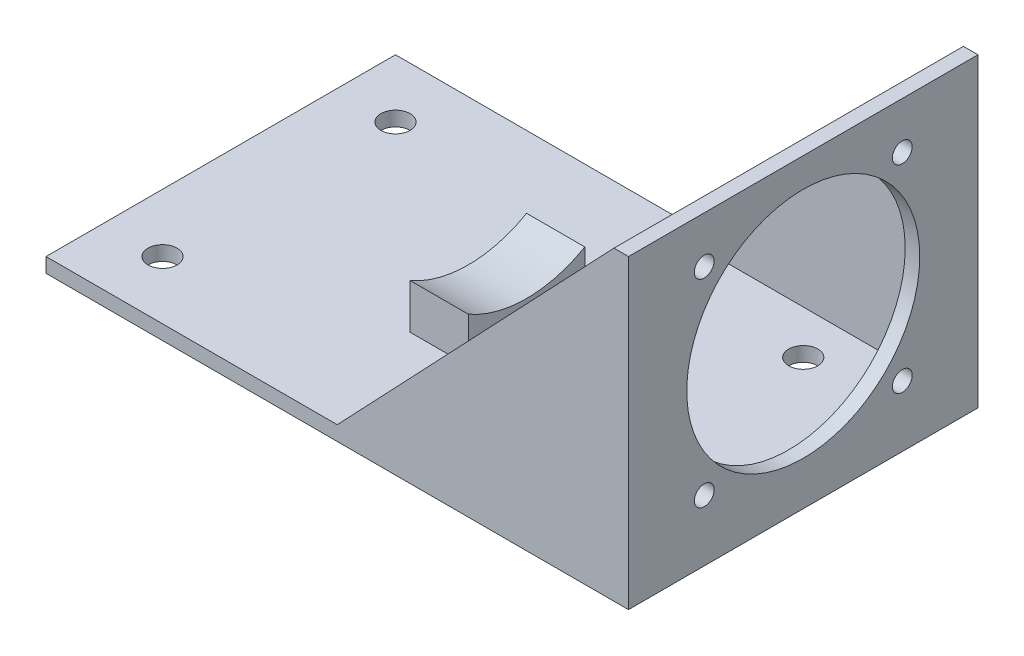
ISO-10303-21;
HEADER;
FILE_DESCRIPTION(('STEP AP214'),'2;1');
FILE_NAME('part.step','',(''),(''),'','','');
FILE_SCHEMA(('AUTOMOTIVE_DESIGN { 1 0 10303 214 1 1 1 1 }'));
ENDSEC;
DATA;
#1=APPLICATION_CONTEXT('core data for automotive mechanical design processes');
#2=APPLICATION_PROTOCOL_DEFINITION('international standard','automotive_design',2000,#1);
#3=PRODUCT_CONTEXT('',#1,'mechanical');
#4=PRODUCT('Part','Part','',(#3));
#5=PRODUCT_RELATED_PRODUCT_CATEGORY('part','',(#4));
#6=PRODUCT_DEFINITION_FORMATION('','',#4);
#7=PRODUCT_DEFINITION_CONTEXT('part definition',#1,'design');
#8=PRODUCT_DEFINITION('design','',#6,#7);
#9=PRODUCT_DEFINITION_SHAPE('','',#8);
#10=(LENGTH_UNIT() NAMED_UNIT(*) SI_UNIT(.MILLI.,.METRE.));
#11=(NAMED_UNIT(*) PLANE_ANGLE_UNIT() SI_UNIT($,.RADIAN.));
#12=(NAMED_UNIT(*) SI_UNIT($,.STERADIAN.) SOLID_ANGLE_UNIT());
#13=UNCERTAINTY_MEASURE_WITH_UNIT(LENGTH_MEASURE(1.E-05),#10,'distance_accuracy_value','');
#14=(GEOMETRIC_REPRESENTATION_CONTEXT(3) GLOBAL_UNCERTAINTY_ASSIGNED_CONTEXT((#13)) GLOBAL_UNIT_ASSIGNED_CONTEXT((#10,
#11,#12)) REPRESENTATION_CONTEXT('',''));
#15=CARTESIAN_POINT('',(0.,0.,0.));
#16=DIRECTION('',(0.,0.,1.));
#17=DIRECTION('',(1.,0.,0.));
#18=AXIS2_PLACEMENT_3D('',#15,#16,#17);
#19=CARTESIAN_POINT('',(0.,6.35,0.));
#20=DIRECTION('',(0.,1.,0.));
#21=DIRECTION('',(0.,0.,1.));
#22=AXIS2_PLACEMENT_3D('',#19,#20,#21);
#23=PLANE('',#22);
#24=CARTESIAN_POINT('',(76.2,6.35,-50.8));
#25=DIRECTION('',(0.,1.,0.));
#26=DIRECTION('',(0.,0.,1.));
#27=AXIS2_PLACEMENT_3D('',#24,#25,#26);
#28=CIRCLE('',#27,6.35);
#29=CARTESIAN_POINT('',(76.2,6.35,-44.45));
#30=VERTEX_POINT('',#29);
#31=EDGE_CURVE('E426',#30,#30,#28,.T.);
#32=ORIENTED_EDGE('',*,*,#31,.F.);
#33=EDGE_LOOP('',(#32));
#34=FACE_BOUND('',#33,.T.);
#35=CARTESIAN_POINT('',(76.2,6.35,50.8));
#36=DIRECTION('',(0.,1.,0.));
#37=DIRECTION('',(0.,0.,1.));
#38=AXIS2_PLACEMENT_3D('',#35,#36,#37);
#39=CIRCLE('',#38,6.35);
#40=CARTESIAN_POINT('',(76.2,6.35,57.15));
#41=VERTEX_POINT('',#40);
#42=EDGE_CURVE('E422',#41,#41,#39,.T.);
#43=ORIENTED_EDGE('',*,*,#42,.F.);
#44=EDGE_LOOP('',(#43));
#45=FACE_BOUND('',#44,.T.);
#46=CARTESIAN_POINT('',(-101.6,6.35,50.8));
#47=DIRECTION('',(0.,1.,0.));
#48=DIRECTION('',(0.,0.,1.));
#49=AXIS2_PLACEMENT_3D('',#46,#47,#48);
#50=CIRCLE('',#49,6.35);
#51=CARTESIAN_POINT('',(-101.6,6.35,57.15));
#52=VERTEX_POINT('',#51);
#53=EDGE_CURVE('E419',#52,#52,#50,.T.);
#54=ORIENTED_EDGE('',*,*,#53,.F.);
#55=EDGE_LOOP('',(#54));
#56=FACE_BOUND('',#55,.T.);
#57=CARTESIAN_POINT('',(-101.6,6.35,-50.8));
#58=DIRECTION('',(0.,1.,0.));
#59=DIRECTION('',(0.,0.,1.));
#60=AXIS2_PLACEMENT_3D('',#57,#58,#59);
#61=CIRCLE('',#60,6.35);
#62=CARTESIAN_POINT('',(-101.6,6.35,-44.45));
#63=VERTEX_POINT('',#62);
#64=EDGE_CURVE('E265',#63,#63,#61,.T.);
#65=ORIENTED_EDGE('',*,*,#64,.F.);
#66=EDGE_LOOP('',(#65));
#67=FACE_BOUND('',#66,.T.);
#68=DIRECTION('',(0.,0.,-1.));
#69=VECTOR('',#68,1.);
#70=CARTESIAN_POINT('',(0.,6.35,-69.85));
#71=LINE('',#70,#69);
#72=CARTESIAN_POINT('',(0.,6.35,-69.85));
#73=VERTEX_POINT('',#72);
#74=CARTESIAN_POINT('',(0.,6.35,-76.2));
#75=VERTEX_POINT('',#74);
#76=EDGE_CURVE('E168',#73,#75,#71,.T.);
#77=ORIENTED_EDGE('',*,*,#76,.T.);
#78=DIRECTION('',(-1.,0.,0.));
#79=VECTOR('',#78,1.);
#80=CARTESIAN_POINT('',(-127.,6.35,-76.2));
#81=LINE('',#80,#79);
#82=CARTESIAN_POINT('',(-127.,6.35,-76.2));
#83=VERTEX_POINT('',#82);
#84=EDGE_CURVE('E235',#75,#83,#81,.T.);
#85=ORIENTED_EDGE('',*,*,#84,.T.);
#86=DIRECTION('',(0.,0.,1.));
#87=VECTOR('',#86,1.);
#88=CARTESIAN_POINT('',(-127.,6.35,-76.2));
#89=LINE('',#88,#87);
#90=CARTESIAN_POINT('',(-127.,6.35,76.2));
#91=VERTEX_POINT('',#90);
#92=EDGE_CURVE('E237',#83,#91,#89,.T.);
#93=ORIENTED_EDGE('',*,*,#92,.T.);
#94=DIRECTION('',(1.,0.,0.));
#95=VECTOR('',#94,1.);
#96=CARTESIAN_POINT('',(-127.,6.35,76.2));
#97=LINE('',#96,#95);
#98=CARTESIAN_POINT('',(0.,6.35,76.2));
#99=VERTEX_POINT('',#98);
#100=EDGE_CURVE('E240',#91,#99,#97,.T.);
#101=ORIENTED_EDGE('',*,*,#100,.T.);
#102=DIRECTION('',(0.,0.,1.));
#103=VECTOR('',#102,1.);
#104=CARTESIAN_POINT('',(0.,6.35,69.85));
#105=LINE('',#104,#103);
#106=CARTESIAN_POINT('',(0.,6.35,69.85));
#107=VERTEX_POINT('',#106);
#108=EDGE_CURVE('E184',#107,#99,#105,.T.);
#109=ORIENTED_EDGE('',*,*,#108,.F.);
#110=DIRECTION('',(1.,0.,0.));
#111=VECTOR('',#110,1.);
#112=CARTESIAN_POINT('',(0.,6.35,69.85));
#113=LINE('',#112,#111);
#114=CARTESIAN_POINT('',(120.65,6.35,69.85));
#115=VERTEX_POINT('',#114);
#116=EDGE_CURVE('E178',#107,#115,#113,.T.);
#117=ORIENTED_EDGE('',*,*,#116,.T.);
#118=DIRECTION('',(0.,0.,-1.));
#119=VECTOR('',#118,1.);
#120=CARTESIAN_POINT('',(120.65,6.35,76.2));
#121=LINE('',#120,#119);
#122=CARTESIAN_POINT('',(120.65,6.35,-69.85));
#123=VERTEX_POINT('',#122);
#124=EDGE_CURVE('E219',#115,#123,#121,.T.);
#125=ORIENTED_EDGE('',*,*,#124,.T.);
#126=DIRECTION('',(-1.,0.,0.));
#127=VECTOR('',#126,1.);
#128=CARTESIAN_POINT('',(0.,6.35,-69.85));
#129=LINE('',#128,#127);
#130=EDGE_CURVE('E162',#123,#73,#129,.T.);
#131=ORIENTED_EDGE('',*,*,#130,.T.);
#132=EDGE_LOOP('',(#77,#85,#93,#101,#109,#117,#125,#131));
#133=FACE_BOUND('',#132,.T.);
#134=DIRECTION('',(-1.,0.,0.));
#135=VECTOR('',#134,1.);
#136=CARTESIAN_POINT('',(-19.05,6.35,-25.4));
#137=LINE('',#136,#135);
#138=CARTESIAN_POINT('',(6.35,6.35,-25.4));
#139=VERTEX_POINT('',#138);
#140=CARTESIAN_POINT('',(-19.05,6.35,-25.4));
#141=VERTEX_POINT('',#140);
#142=EDGE_CURVE('E149',#139,#141,#137,.T.);
#143=ORIENTED_EDGE('',*,*,#142,.F.);
#144=DIRECTION('',(0.,0.,-1.));
#145=VECTOR('',#144,1.);
#146=CARTESIAN_POINT('',(6.35,6.35,-25.4));
#147=LINE('',#146,#145);
#148=CARTESIAN_POINT('',(6.35000000000001,6.35,25.4));
#149=VERTEX_POINT('',#148);
#150=EDGE_CURVE('E140',#149,#139,#147,.T.);
#151=ORIENTED_EDGE('',*,*,#150,.F.);
#152=DIRECTION('',(1.,0.,0.));
#153=VECTOR('',#152,1.);
#154=CARTESIAN_POINT('',(-19.05,6.35,25.4));
#155=LINE('',#154,#153);
#156=CARTESIAN_POINT('',(-19.05,6.35,25.4));
#157=VERTEX_POINT('',#156);
#158=EDGE_CURVE('E434',#157,#149,#155,.T.);
#159=ORIENTED_EDGE('',*,*,#158,.F.);
#160=DIRECTION('',(0.,0.,1.));
#161=VECTOR('',#160,1.);
#162=CARTESIAN_POINT('',(-19.05,6.35,-25.4));
#163=LINE('',#162,#161);
#164=EDGE_CURVE('E432',#141,#157,#163,.T.);
#165=ORIENTED_EDGE('',*,*,#164,.F.);
#166=EDGE_LOOP('',(#143,#151,#159,#165));
#167=FACE_BOUND('',#166,.T.);
#168=ADVANCED_FACE('F38',(#34,#45,#56,#67,#133,#167),#23,.T.);
#169=CARTESIAN_POINT('',(120.65,0.,0.));
#170=DIRECTION('',(-1.,0.,0.));
#171=DIRECTION('',(0.,0.,1.));
#172=AXIS2_PLACEMENT_3D('',#169,#170,#171);
#173=PLANE('',#172);
#174=CARTESIAN_POINT('',(120.65,113.03,43.18));
#175=DIRECTION('',(1.,0.,0.));
#176=DIRECTION('',(0.,0.,-1.));
#177=AXIS2_PLACEMENT_3D('',#174,#175,#176);
#178=CIRCLE('',#177,4.318);
#179=CARTESIAN_POINT('',(120.65,113.03,38.862));
#180=VERTEX_POINT('',#179);
#181=EDGE_CURVE('E189',#180,#180,#178,.T.);
#182=ORIENTED_EDGE('',*,*,#181,.T.);
#183=EDGE_LOOP('',(#182));
#184=FACE_BOUND('',#183,.T.);
#185=CARTESIAN_POINT('',(120.65,113.03,-43.18));
#186=DIRECTION('',(1.,0.,0.));
#187=DIRECTION('',(0.,0.,-1.));
#188=AXIS2_PLACEMENT_3D('',#185,#186,#187);
#189=CIRCLE('',#188,4.318);
#190=CARTESIAN_POINT('',(120.65,113.03,-47.498));
#191=VERTEX_POINT('',#190);
#192=EDGE_CURVE('E195',#191,#191,#189,.T.);
#193=ORIENTED_EDGE('',*,*,#192,.T.);
#194=EDGE_LOOP('',(#193));
#195=FACE_BOUND('',#194,.T.);
#196=CARTESIAN_POINT('',(120.65,26.67,-43.18));
#197=DIRECTION('',(1.,0.,0.));
#198=DIRECTION('',(0.,0.,-1.));
#199=AXIS2_PLACEMENT_3D('',#196,#197,#198);
#200=CIRCLE('',#199,4.318);
#201=CARTESIAN_POINT('',(120.65,26.67,-47.498));
#202=VERTEX_POINT('',#201);
#203=EDGE_CURVE('E201',#202,#202,#200,.T.);
#204=ORIENTED_EDGE('',*,*,#203,.T.);
#205=EDGE_LOOP('',(#204));
#206=FACE_BOUND('',#205,.T.);
#207=CARTESIAN_POINT('',(120.65,26.67,43.18));
#208=DIRECTION('',(1.,0.,0.));
#209=DIRECTION('',(0.,0.,-1.));
#210=AXIS2_PLACEMENT_3D('',#207,#208,#209);
#211=CIRCLE('',#210,4.318);
#212=CARTESIAN_POINT('',(120.65,26.67,38.862));
#213=VERTEX_POINT('',#212);
#214=EDGE_CURVE('E207',#213,#213,#211,.T.);
#215=ORIENTED_EDGE('',*,*,#214,.T.);
#216=EDGE_LOOP('',(#215));
#217=FACE_BOUND('',#216,.T.);
#218=CARTESIAN_POINT('',(120.65,69.85,0.));
#219=DIRECTION('',(1.,0.,0.));
#220=DIRECTION('',(0.,0.,-1.));
#221=AXIS2_PLACEMENT_3D('',#218,#219,#220);
#222=CIRCLE('',#221,50.8);
#223=CARTESIAN_POINT('',(120.65,69.85,-50.8));
#224=VERTEX_POINT('',#223);
#225=EDGE_CURVE('E213',#224,#224,#222,.T.);
#226=ORIENTED_EDGE('',*,*,#225,.T.);
#227=EDGE_LOOP('',(#226));
#228=FACE_BOUND('',#227,.T.);
#229=DIRECTION('',(0.,0.,1.));
#230=VECTOR('',#229,1.);
#231=CARTESIAN_POINT('',(120.65,133.35,76.2));
#232=LINE('',#231,#230);
#233=CARTESIAN_POINT('',(120.65,133.35,-69.85));
#234=VERTEX_POINT('',#233);
#235=CARTESIAN_POINT('',(120.65,133.35,69.85));
#236=VERTEX_POINT('',#235);
#237=EDGE_CURVE('E222',#234,#236,#232,.T.);
#238=ORIENTED_EDGE('',*,*,#237,.F.);
#239=DIRECTION('',(0.,-1.,0.));
#240=VECTOR('',#239,1.);
#241=CARTESIAN_POINT('',(120.65,6.35,-69.85));
#242=LINE('',#241,#240);
#243=EDGE_CURVE('E159',#234,#123,#242,.T.);
#244=ORIENTED_EDGE('',*,*,#243,.T.);
#245=ORIENTED_EDGE('',*,*,#124,.F.);
#246=DIRECTION('',(0.,1.,0.));
#247=VECTOR('',#246,1.);
#248=CARTESIAN_POINT('',(120.65,6.35,69.85));
#249=LINE('',#248,#247);
#250=EDGE_CURVE('E173',#115,#236,#249,.T.);
#251=ORIENTED_EDGE('',*,*,#250,.T.);
#252=EDGE_LOOP('',(#238,#244,#245,#251));
#253=FACE_BOUND('',#252,.T.);
#254=ADVANCED_FACE('F289',(#184,#195,#206,#217,#228,#253),#173,.T.);
#255=CARTESIAN_POINT('',(127.,6.35,-76.2));
#256=DIRECTION('',(-1.,0.,0.));
#257=DIRECTION('',(0.,0.,1.));
#258=AXIS2_PLACEMENT_3D('',#255,#256,#257);
#259=PLANE('',#258);
#260=DIRECTION('',(0.,0.,-1.));
#261=VECTOR('',#260,1.);
#262=CARTESIAN_POINT('',(127.,0.,-76.2));
#263=LINE('',#262,#261);
#264=CARTESIAN_POINT('',(127.,0.,76.2));
#265=VERTEX_POINT('',#264);
#266=CARTESIAN_POINT('',(127.,0.,-76.2));
#267=VERTEX_POINT('',#266);
#268=EDGE_CURVE('E232',#265,#267,#263,.T.);
#269=ORIENTED_EDGE('',*,*,#268,.T.);
#270=DIRECTION('',(0.,-1.,0.));
#271=VECTOR('',#270,1.);
#272=CARTESIAN_POINT('',(127.,6.35,-76.2));
#273=LINE('',#272,#271);
#274=CARTESIAN_POINT('',(127.,133.35,-76.2));
#275=VERTEX_POINT('',#274);
#276=EDGE_CURVE('E47',#275,#267,#273,.T.);
#277=ORIENTED_EDGE('',*,*,#276,.F.);
#278=DIRECTION('',(0.,0.,1.));
#279=VECTOR('',#278,1.);
#280=CARTESIAN_POINT('',(127.,133.35,76.2));
#281=LINE('',#280,#279);
#282=CARTESIAN_POINT('',(127.,133.35,76.2));
#283=VERTEX_POINT('',#282);
#284=EDGE_CURVE('E216',#275,#283,#281,.T.);
#285=ORIENTED_EDGE('',*,*,#284,.T.);
#286=DIRECTION('',(0.,-1.,0.));
#287=VECTOR('',#286,1.);
#288=CARTESIAN_POINT('',(127.,6.35,76.2));
#289=LINE('',#288,#287);
#290=EDGE_CURVE('E243',#283,#265,#289,.T.);
#291=ORIENTED_EDGE('',*,*,#290,.T.);
#292=EDGE_LOOP('',(#269,#277,#285,#291));
#293=FACE_BOUND('',#292,.T.);
#294=CARTESIAN_POINT('',(127.,113.03,43.18));
#295=DIRECTION('',(1.,0.,0.));
#296=DIRECTION('',(0.,0.,-1.));
#297=AXIS2_PLACEMENT_3D('',#294,#295,#296);
#298=CIRCLE('',#297,4.318);
#299=CARTESIAN_POINT('',(127.,113.03,38.862));
#300=VERTEX_POINT('',#299);
#301=EDGE_CURVE('E186',#300,#300,#298,.T.);
#302=ORIENTED_EDGE('',*,*,#301,.F.);
#303=EDGE_LOOP('',(#302));
#304=FACE_BOUND('',#303,.T.);
#305=CARTESIAN_POINT('',(127.,113.03,-43.18));
#306=DIRECTION('',(1.,0.,0.));
#307=DIRECTION('',(0.,0.,-1.));
#308=AXIS2_PLACEMENT_3D('',#305,#306,#307);
#309=CIRCLE('',#308,4.318);
#310=CARTESIAN_POINT('',(127.,113.03,-47.498));
#311=VERTEX_POINT('',#310);
#312=EDGE_CURVE('E192',#311,#311,#309,.T.);
#313=ORIENTED_EDGE('',*,*,#312,.F.);
#314=EDGE_LOOP('',(#313));
#315=FACE_BOUND('',#314,.T.);
#316=CARTESIAN_POINT('',(127.,26.67,-43.18));
#317=DIRECTION('',(1.,0.,0.));
#318=DIRECTION('',(0.,0.,-1.));
#319=AXIS2_PLACEMENT_3D('',#316,#317,#318);
#320=CIRCLE('',#319,4.318);
#321=CARTESIAN_POINT('',(127.,26.67,-47.498));
#322=VERTEX_POINT('',#321);
#323=EDGE_CURVE('E198',#322,#322,#320,.T.);
#324=ORIENTED_EDGE('',*,*,#323,.F.);
#325=EDGE_LOOP('',(#324));
#326=FACE_BOUND('',#325,.T.);
#327=CARTESIAN_POINT('',(127.,26.67,43.18));
#328=DIRECTION('',(1.,0.,0.));
#329=DIRECTION('',(0.,0.,-1.));
#330=AXIS2_PLACEMENT_3D('',#327,#328,#329);
#331=CIRCLE('',#330,4.318);
#332=CARTESIAN_POINT('',(127.,26.67,38.862));
#333=VERTEX_POINT('',#332);
#334=EDGE_CURVE('E204',#333,#333,#331,.T.);
#335=ORIENTED_EDGE('',*,*,#334,.F.);
#336=EDGE_LOOP('',(#335));
#337=FACE_BOUND('',#336,.T.);
#338=CARTESIAN_POINT('',(127.,69.85,0.));
#339=DIRECTION('',(1.,0.,0.));
#340=DIRECTION('',(0.,0.,-1.));
#341=AXIS2_PLACEMENT_3D('',#338,#339,#340);
#342=CIRCLE('',#341,50.8);
#343=CARTESIAN_POINT('',(127.,69.85,-50.8));
#344=VERTEX_POINT('',#343);
#345=EDGE_CURVE('E210',#344,#344,#342,.T.);
#346=ORIENTED_EDGE('',*,*,#345,.F.);
#347=EDGE_LOOP('',(#346));
#348=FACE_BOUND('',#347,.T.);
#349=ADVANCED_FACE('F40',(#293,#304,#315,#326,#337,#348),#259,.F.);
#350=CARTESIAN_POINT('',(-127.,6.35,-76.2));
#351=DIRECTION('',(0.,0.,1.));
#352=DIRECTION('',(1.,0.,0.));
#353=AXIS2_PLACEMENT_3D('',#350,#351,#352);
#354=PLANE('',#353);
#355=ORIENTED_EDGE('',*,*,#84,.F.);
#356=DIRECTION('',(0.688749461914693,0.724999433594414,0.));
#357=VECTOR('',#356,1.);
#358=CARTESIAN_POINT('',(120.65,133.35,-76.2));
#359=LINE('',#358,#357);
#360=CARTESIAN_POINT('',(120.65,133.35,-76.2));
#361=VERTEX_POINT('',#360);
#362=EDGE_CURVE('E153',#75,#361,#359,.T.);
#363=ORIENTED_EDGE('',*,*,#362,.T.);
#364=DIRECTION('',(1.,0.,0.));
#365=VECTOR('',#364,1.);
#366=CARTESIAN_POINT('',(120.65,133.35,-76.2));
#367=LINE('',#366,#365);
#368=EDGE_CURVE('E226',#361,#275,#367,.T.);
#369=ORIENTED_EDGE('',*,*,#368,.T.);
#370=ORIENTED_EDGE('',*,*,#276,.T.);
#371=DIRECTION('',(-1.,0.,0.));
#372=VECTOR('',#371,1.);
#373=CARTESIAN_POINT('',(-127.,0.,-76.2));
#374=LINE('',#373,#372);
#375=CARTESIAN_POINT('',(-127.,0.,-76.2));
#376=VERTEX_POINT('',#375);
#377=EDGE_CURVE('E246',#267,#376,#374,.T.);
#378=ORIENTED_EDGE('',*,*,#377,.T.);
#379=DIRECTION('',(0.,-1.,0.));
#380=VECTOR('',#379,1.);
#381=CARTESIAN_POINT('',(-127.,6.35,-76.2));
#382=LINE('',#381,#380);
#383=EDGE_CURVE('E256',#83,#376,#382,.T.);
#384=ORIENTED_EDGE('',*,*,#383,.F.);
#385=EDGE_LOOP('',(#355,#363,#369,#370,#378,#384));
#386=FACE_BOUND('',#385,.T.);
#387=ADVANCED_FACE('F310',(#386),#354,.F.);
#388=CARTESIAN_POINT('',(-127.,6.35,-76.2));
#389=DIRECTION('',(1.,0.,0.));
#390=DIRECTION('',(0.,0.,-1.));
#391=AXIS2_PLACEMENT_3D('',#388,#389,#390);
#392=PLANE('',#391);
#393=DIRECTION('',(0.,0.,1.));
#394=VECTOR('',#393,1.);
#395=CARTESIAN_POINT('',(-127.,0.,-76.2));
#396=LINE('',#395,#394);
#397=CARTESIAN_POINT('',(-127.,0.,76.2));
#398=VERTEX_POINT('',#397);
#399=EDGE_CURVE('E248',#376,#398,#396,.T.);
#400=ORIENTED_EDGE('',*,*,#399,.T.);
#401=DIRECTION('',(0.,-1.,0.));
#402=VECTOR('',#401,1.);
#403=CARTESIAN_POINT('',(-127.,6.35,76.2));
#404=LINE('',#403,#402);
#405=EDGE_CURVE('E253',#91,#398,#404,.T.);
#406=ORIENTED_EDGE('',*,*,#405,.F.);
#407=ORIENTED_EDGE('',*,*,#92,.F.);
#408=ORIENTED_EDGE('',*,*,#383,.T.);
#409=EDGE_LOOP('',(#400,#406,#407,#408));
#410=FACE_BOUND('',#409,.T.);
#411=ADVANCED_FACE('F307',(#410),#392,.F.);
#412=CARTESIAN_POINT('',(-127.,6.35,76.2));
#413=DIRECTION('',(0.,0.,-1.));
#414=DIRECTION('',(-1.,0.,0.));
#415=AXIS2_PLACEMENT_3D('',#412,#413,#414);
#416=PLANE('',#415);
#417=DIRECTION('',(1.,0.,0.));
#418=VECTOR('',#417,1.);
#419=CARTESIAN_POINT('',(-127.,0.,76.2));
#420=LINE('',#419,#418);
#421=EDGE_CURVE('E238',#398,#265,#420,.T.);
#422=ORIENTED_EDGE('',*,*,#421,.T.);
#423=ORIENTED_EDGE('',*,*,#290,.F.);
#424=DIRECTION('',(1.,0.,0.));
#425=VECTOR('',#424,1.);
#426=CARTESIAN_POINT('',(120.65,133.35,76.2));
#427=LINE('',#426,#425);
#428=CARTESIAN_POINT('',(120.65,133.35,76.2));
#429=VERTEX_POINT('',#428);
#430=EDGE_CURVE('E229',#429,#283,#427,.T.);
#431=ORIENTED_EDGE('',*,*,#430,.F.);
#432=DIRECTION('',(-0.688749461914693,-0.724999433594414,0.));
#433=VECTOR('',#432,1.);
#434=CARTESIAN_POINT('',(120.65,133.35,76.2));
#435=LINE('',#434,#433);
#436=EDGE_CURVE('E172',#429,#99,#435,.T.);
#437=ORIENTED_EDGE('',*,*,#436,.T.);
#438=ORIENTED_EDGE('',*,*,#100,.F.);
#439=ORIENTED_EDGE('',*,*,#405,.T.);
#440=EDGE_LOOP('',(#422,#423,#431,#437,#438,#439));
#441=FACE_BOUND('',#440,.T.);
#442=ADVANCED_FACE('F304',(#441),#416,.F.);
#443=CARTESIAN_POINT('',(0.,0.,0.));
#444=DIRECTION('',(0.,1.,0.));
#445=DIRECTION('',(0.,0.,1.));
#446=AXIS2_PLACEMENT_3D('',#443,#444,#445);
#447=PLANE('',#446);
#448=CARTESIAN_POINT('',(76.2,0.,-50.8));
#449=DIRECTION('',(0.,1.,0.));
#450=DIRECTION('',(0.,0.,1.));
#451=AXIS2_PLACEMENT_3D('',#448,#449,#450);
#452=CIRCLE('',#451,6.35);
#453=CARTESIAN_POINT('',(76.2,0.,-44.45));
#454=VERTEX_POINT('',#453);
#455=EDGE_CURVE('E42',#454,#454,#452,.T.);
#456=ORIENTED_EDGE('',*,*,#455,.T.);
#457=EDGE_LOOP('',(#456));
#458=FACE_BOUND('',#457,.T.);
#459=CARTESIAN_POINT('',(76.2,0.,50.8));
#460=DIRECTION('',(0.,1.,0.));
#461=DIRECTION('',(0.,0.,1.));
#462=AXIS2_PLACEMENT_3D('',#459,#460,#461);
#463=CIRCLE('',#462,6.35);
#464=CARTESIAN_POINT('',(76.2,0.,57.15));
#465=VERTEX_POINT('',#464);
#466=EDGE_CURVE('E267',#465,#465,#463,.T.);
#467=ORIENTED_EDGE('',*,*,#466,.T.);
#468=EDGE_LOOP('',(#467));
#469=FACE_BOUND('',#468,.T.);
#470=CARTESIAN_POINT('',(-101.6,0.,50.8));
#471=DIRECTION('',(0.,1.,0.));
#472=DIRECTION('',(0.,0.,1.));
#473=AXIS2_PLACEMENT_3D('',#470,#471,#472);
#474=CIRCLE('',#473,6.35);
#475=CARTESIAN_POINT('',(-101.6,0.,57.15));
#476=VERTEX_POINT('',#475);
#477=EDGE_CURVE('E264',#476,#476,#474,.T.);
#478=ORIENTED_EDGE('',*,*,#477,.T.);
#479=EDGE_LOOP('',(#478));
#480=FACE_BOUND('',#479,.T.);
#481=CARTESIAN_POINT('',(-101.6,0.,-50.8));
#482=DIRECTION('',(0.,1.,0.));
#483=DIRECTION('',(0.,0.,1.));
#484=AXIS2_PLACEMENT_3D('',#481,#482,#483);
#485=CIRCLE('',#484,6.35);
#486=CARTESIAN_POINT('',(-101.6,0.,-44.45));
#487=VERTEX_POINT('',#486);
#488=EDGE_CURVE('E261',#487,#487,#485,.T.);
#489=ORIENTED_EDGE('',*,*,#488,.T.);
#490=EDGE_LOOP('',(#489));
#491=FACE_BOUND('',#490,.T.);
#492=ORIENTED_EDGE('',*,*,#268,.F.);
#493=ORIENTED_EDGE('',*,*,#421,.F.);
#494=ORIENTED_EDGE('',*,*,#399,.F.);
#495=ORIENTED_EDGE('',*,*,#377,.F.);
#496=EDGE_LOOP('',(#492,#493,#494,#495));
#497=FACE_BOUND('',#496,.T.);
#498=ADVANCED_FACE('F274',(#458,#469,#480,#491,#497),#447,.F.);
#499=CARTESIAN_POINT('',(120.65,133.35,76.2));
#500=DIRECTION('',(0.,1.,0.));
#501=DIRECTION('',(0.,0.,1.));
#502=AXIS2_PLACEMENT_3D('',#499,#500,#501);
#503=PLANE('',#502);
#504=ORIENTED_EDGE('',*,*,#284,.F.);
#505=ORIENTED_EDGE('',*,*,#368,.F.);
#506=EDGE_CURVE('E223',#361,#234,#232,.T.);
#507=ORIENTED_EDGE('',*,*,#506,.T.);
#508=ORIENTED_EDGE('',*,*,#237,.T.);
#509=DIRECTION('',(0.,0.,1.));
#510=VECTOR('',#509,1.);
#511=CARTESIAN_POINT('',(120.65,133.35,69.85));
#512=LINE('',#511,#510);
#513=EDGE_CURVE('E181',#236,#429,#512,.T.);
#514=ORIENTED_EDGE('',*,*,#513,.T.);
#515=ORIENTED_EDGE('',*,*,#430,.T.);
#516=EDGE_LOOP('',(#504,#505,#507,#508,#514,#515));
#517=FACE_BOUND('',#516,.T.);
#518=ADVANCED_FACE('F301',(#517),#503,.T.);
#519=CARTESIAN_POINT('',(120.65,69.85,0.));
#520=DIRECTION('',(1.,0.,0.));
#521=DIRECTION('',(0.,0.,-1.));
#522=AXIS2_PLACEMENT_3D('',#519,#520,#521);
#523=CYLINDRICAL_SURFACE('',#522,50.8);
#524=ORIENTED_EDGE('',*,*,#225,.F.);
#525=EDGE_LOOP('',(#524));
#526=FACE_BOUND('',#525,.T.);
#527=ORIENTED_EDGE('',*,*,#345,.T.);
#528=EDGE_LOOP('',(#527));
#529=FACE_BOUND('',#528,.T.);
#530=ADVANCED_FACE('F361',(#526,#529),#523,.F.);
#531=CARTESIAN_POINT('',(120.65,26.67,43.18));
#532=DIRECTION('',(1.,0.,0.));
#533=DIRECTION('',(0.,0.,-1.));
#534=AXIS2_PLACEMENT_3D('',#531,#532,#533);
#535=CYLINDRICAL_SURFACE('',#534,4.318);
#536=ORIENTED_EDGE('',*,*,#214,.F.);
#537=EDGE_LOOP('',(#536));
#538=FACE_BOUND('',#537,.T.);
#539=ORIENTED_EDGE('',*,*,#334,.T.);
#540=EDGE_LOOP('',(#539));
#541=FACE_BOUND('',#540,.T.);
#542=ADVANCED_FACE('F363',(#538,#541),#535,.F.);
#543=CARTESIAN_POINT('',(120.65,26.67,-43.18));
#544=DIRECTION('',(1.,0.,0.));
#545=DIRECTION('',(0.,0.,-1.));
#546=AXIS2_PLACEMENT_3D('',#543,#544,#545);
#547=CYLINDRICAL_SURFACE('',#546,4.318);
#548=ORIENTED_EDGE('',*,*,#203,.F.);
#549=EDGE_LOOP('',(#548));
#550=FACE_BOUND('',#549,.T.);
#551=ORIENTED_EDGE('',*,*,#323,.T.);
#552=EDGE_LOOP('',(#551));
#553=FACE_BOUND('',#552,.T.);
#554=ADVANCED_FACE('F370',(#550,#553),#547,.F.);
#555=CARTESIAN_POINT('',(120.65,113.03,-43.18));
#556=DIRECTION('',(1.,0.,0.));
#557=DIRECTION('',(0.,0.,-1.));
#558=AXIS2_PLACEMENT_3D('',#555,#556,#557);
#559=CYLINDRICAL_SURFACE('',#558,4.318);
#560=ORIENTED_EDGE('',*,*,#192,.F.);
#561=EDGE_LOOP('',(#560));
#562=FACE_BOUND('',#561,.T.);
#563=ORIENTED_EDGE('',*,*,#312,.T.);
#564=EDGE_LOOP('',(#563));
#565=FACE_BOUND('',#564,.T.);
#566=ADVANCED_FACE('F377',(#562,#565),#559,.F.);
#567=CARTESIAN_POINT('',(120.65,113.03,43.18));
#568=DIRECTION('',(1.,0.,0.));
#569=DIRECTION('',(0.,0.,-1.));
#570=AXIS2_PLACEMENT_3D('',#567,#568,#569);
#571=CYLINDRICAL_SURFACE('',#570,4.318);
#572=ORIENTED_EDGE('',*,*,#181,.F.);
#573=EDGE_LOOP('',(#572));
#574=FACE_BOUND('',#573,.T.);
#575=ORIENTED_EDGE('',*,*,#301,.T.);
#576=EDGE_LOOP('',(#575));
#577=FACE_BOUND('',#576,.T.);
#578=ADVANCED_FACE('F381',(#574,#577),#571,.F.);
#579=CARTESIAN_POINT('',(120.65,133.35,69.85));
#580=DIRECTION('',(-0.724999433594414,0.688749461914693,0.));
#581=DIRECTION('',(-0.688749461914693,-0.724999433594414,0.));
#582=AXIS2_PLACEMENT_3D('',#579,#580,#581);
#583=PLANE('',#582);
#584=ORIENTED_EDGE('',*,*,#436,.F.);
#585=ORIENTED_EDGE('',*,*,#513,.F.);
#586=DIRECTION('',(-0.688749461914693,-0.724999433594414,0.));
#587=VECTOR('',#586,1.);
#588=CARTESIAN_POINT('',(120.65,133.35,69.85));
#589=LINE('',#588,#587);
#590=EDGE_CURVE('E176',#236,#107,#589,.T.);
#591=ORIENTED_EDGE('',*,*,#590,.T.);
#592=ORIENTED_EDGE('',*,*,#108,.T.);
#593=EDGE_LOOP('',(#584,#585,#591,#592));
#594=FACE_BOUND('',#593,.T.);
#595=ADVANCED_FACE('F340',(#594),#583,.T.);
#596=CARTESIAN_POINT('',(0.,0.,69.85));
#597=DIRECTION('',(0.,0.,-1.));
#598=DIRECTION('',(-1.,0.,0.));
#599=AXIS2_PLACEMENT_3D('',#596,#597,#598);
#600=PLANE('',#599);
#601=ORIENTED_EDGE('',*,*,#250,.F.);
#602=ORIENTED_EDGE('',*,*,#116,.F.);
#603=ORIENTED_EDGE('',*,*,#590,.F.);
#604=EDGE_LOOP('',(#601,#602,#603));
#605=FACE_BOUND('',#604,.T.);
#606=ADVANCED_FACE('F337',(#605),#600,.T.);
#607=CARTESIAN_POINT('',(120.65,133.35,-69.85));
#608=DIRECTION('',(-0.724999433594414,0.688749461914693,0.));
#609=DIRECTION('',(-0.688749461914693,-0.724999433594414,0.));
#610=AXIS2_PLACEMENT_3D('',#607,#608,#609);
#611=PLANE('',#610);
#612=ORIENTED_EDGE('',*,*,#362,.F.);
#613=ORIENTED_EDGE('',*,*,#76,.F.);
#614=DIRECTION('',(0.688749461914693,0.724999433594414,0.));
#615=VECTOR('',#614,1.);
#616=CARTESIAN_POINT('',(120.65,133.35,-69.85));
#617=LINE('',#616,#615);
#618=EDGE_CURVE('E165',#73,#234,#617,.T.);
#619=ORIENTED_EDGE('',*,*,#618,.T.);
#620=ORIENTED_EDGE('',*,*,#506,.F.);
#621=EDGE_LOOP('',(#612,#613,#619,#620));
#622=FACE_BOUND('',#621,.T.);
#623=ADVANCED_FACE('F327',(#622),#611,.T.);
#624=CARTESIAN_POINT('',(0.,0.,-69.85));
#625=DIRECTION('',(0.,0.,-1.));
#626=DIRECTION('',(-1.,0.,0.));
#627=AXIS2_PLACEMENT_3D('',#624,#625,#626);
#628=PLANE('',#627);
#629=ORIENTED_EDGE('',*,*,#243,.F.);
#630=ORIENTED_EDGE('',*,*,#618,.F.);
#631=ORIENTED_EDGE('',*,*,#130,.F.);
#632=EDGE_LOOP('',(#629,#630,#631));
#633=FACE_BOUND('',#632,.T.);
#634=ADVANCED_FACE('F330',(#633),#628,.F.);
#635=CARTESIAN_POINT('',(6.35,31.75,-25.4));
#636=DIRECTION('',(-1.,0.,0.));
#637=DIRECTION('',(0.,0.,1.));
#638=AXIS2_PLACEMENT_3D('',#635,#636,#637);
#639=PLANE('',#638);
#640=DIRECTION('',(0.,-1.,0.));
#641=VECTOR('',#640,1.);
#642=CARTESIAN_POINT('',(6.35,31.75,-25.4));
#643=LINE('',#642,#641);
#644=CARTESIAN_POINT('',(6.35,25.8559094877505,-25.4));
#645=VERTEX_POINT('',#644);
#646=EDGE_CURVE('E151',#645,#139,#643,.T.);
#647=ORIENTED_EDGE('',*,*,#646,.F.);
#648=CARTESIAN_POINT('',(6.35,69.85,0.));
#649=DIRECTION('',(-1.,0.,0.));
#650=DIRECTION('',(0.,0.,1.));
#651=AXIS2_PLACEMENT_3D('',#648,#649,#650);
#652=CIRCLE('',#651,50.8);
#653=CARTESIAN_POINT('',(6.35000000000001,25.8559094877505,25.4));
#654=VERTEX_POINT('',#653);
#655=EDGE_CURVE('E136',#645,#654,#652,.T.);
#656=ORIENTED_EDGE('',*,*,#655,.T.);
#657=DIRECTION('',(0.,-1.,0.));
#658=VECTOR('',#657,1.);
#659=CARTESIAN_POINT('',(6.35000000000001,31.75,25.4));
#660=LINE('',#659,#658);
#661=EDGE_CURVE('E155',#654,#149,#660,.T.);
#662=ORIENTED_EDGE('',*,*,#661,.T.);
#663=ORIENTED_EDGE('',*,*,#150,.T.);
#664=EDGE_LOOP('',(#647,#656,#662,#663));
#665=FACE_BOUND('',#664,.T.);
#666=ADVANCED_FACE('F394',(#665),#639,.F.);
#667=CARTESIAN_POINT('',(-19.05,31.75,-25.4));
#668=DIRECTION('',(0.,0.,1.));
#669=DIRECTION('',(1.,0.,0.));
#670=AXIS2_PLACEMENT_3D('',#667,#668,#669);
#671=PLANE('',#670);
#672=DIRECTION('',(0.,-1.,0.));
#673=VECTOR('',#672,1.);
#674=CARTESIAN_POINT('',(-19.05,31.75,-25.4));
#675=LINE('',#674,#673);
#676=CARTESIAN_POINT('',(-19.05,25.8559094877505,-25.4));
#677=VERTEX_POINT('',#676);
#678=EDGE_CURVE('E144',#677,#141,#675,.T.);
#679=ORIENTED_EDGE('',*,*,#678,.F.);
#680=DIRECTION('',(-1.,0.,0.));
#681=VECTOR('',#680,1.);
#682=CARTESIAN_POINT('',(6.35,25.8559094877505,-25.4));
#683=LINE('',#682,#681);
#684=EDGE_CURVE('E133',#677,#645,#683,.F.);
#685=ORIENTED_EDGE('',*,*,#684,.T.);
#686=ORIENTED_EDGE('',*,*,#646,.T.);
#687=ORIENTED_EDGE('',*,*,#142,.T.);
#688=EDGE_LOOP('',(#679,#685,#686,#687));
#689=FACE_BOUND('',#688,.T.);
#690=ADVANCED_FACE('F147',(#689),#671,.F.);
#691=CARTESIAN_POINT('',(-19.05,31.75,-25.4));
#692=DIRECTION('',(1.,0.,0.));
#693=DIRECTION('',(0.,0.,-1.));
#694=AXIS2_PLACEMENT_3D('',#691,#692,#693);
#695=PLANE('',#694);
#696=DIRECTION('',(0.,-1.,0.));
#697=VECTOR('',#696,1.);
#698=CARTESIAN_POINT('',(-19.05,31.75,25.4));
#699=LINE('',#698,#697);
#700=CARTESIAN_POINT('',(-19.05,25.8559094877505,25.4));
#701=VERTEX_POINT('',#700);
#702=EDGE_CURVE('E61',#701,#157,#699,.T.);
#703=ORIENTED_EDGE('',*,*,#702,.F.);
#704=CARTESIAN_POINT('',(-19.05,69.85,0.));
#705=DIRECTION('',(-1.,0.,0.));
#706=DIRECTION('',(0.,0.,1.));
#707=AXIS2_PLACEMENT_3D('',#704,#705,#706);
#708=CIRCLE('',#707,50.8);
#709=EDGE_CURVE('E55',#677,#701,#708,.T.);
#710=ORIENTED_EDGE('',*,*,#709,.F.);
#711=ORIENTED_EDGE('',*,*,#678,.T.);
#712=ORIENTED_EDGE('',*,*,#164,.T.);
#713=EDGE_LOOP('',(#703,#710,#711,#712));
#714=FACE_BOUND('',#713,.T.);
#715=ADVANCED_FACE('F143',(#714),#695,.F.);
#716=CARTESIAN_POINT('',(-19.05,31.75,25.4));
#717=DIRECTION('',(0.,0.,-1.));
#718=DIRECTION('',(-1.,0.,0.));
#719=AXIS2_PLACEMENT_3D('',#716,#717,#718);
#720=PLANE('',#719);
#721=ORIENTED_EDGE('',*,*,#661,.F.);
#722=DIRECTION('',(-1.,0.,0.));
#723=VECTOR('',#722,1.);
#724=CARTESIAN_POINT('',(6.35,25.8559094877505,25.4));
#725=LINE('',#724,#723);
#726=EDGE_CURVE('E11',#654,#701,#725,.T.);
#727=ORIENTED_EDGE('',*,*,#726,.T.);
#728=ORIENTED_EDGE('',*,*,#702,.T.);
#729=ORIENTED_EDGE('',*,*,#158,.T.);
#730=EDGE_LOOP('',(#721,#727,#728,#729));
#731=FACE_BOUND('',#730,.T.);
#732=ADVANCED_FACE('F402',(#731),#720,.F.);
#733=CARTESIAN_POINT('',(6.35,69.85,0.));
#734=DIRECTION('',(-1.,0.,0.));
#735=DIRECTION('',(0.,0.,1.));
#736=AXIS2_PLACEMENT_3D('',#733,#734,#735);
#737=CYLINDRICAL_SURFACE('',#736,50.8);
#738=ORIENTED_EDGE('',*,*,#709,.T.);
#739=ORIENTED_EDGE('',*,*,#726,.F.);
#740=ORIENTED_EDGE('',*,*,#655,.F.);
#741=ORIENTED_EDGE('',*,*,#684,.F.);
#742=EDGE_LOOP('',(#738,#739,#740,#741));
#743=FACE_BOUND('',#742,.T.);
#744=ADVANCED_FACE('F134',(#743),#737,.F.);
#745=CARTESIAN_POINT('',(-101.6,-19.05,-50.8));
#746=DIRECTION('',(0.,1.,0.));
#747=DIRECTION('',(0.,0.,1.));
#748=AXIS2_PLACEMENT_3D('',#745,#746,#747);
#749=CYLINDRICAL_SURFACE('',#748,6.35);
#750=ORIENTED_EDGE('',*,*,#64,.T.);
#751=EDGE_LOOP('',(#750));
#752=FACE_BOUND('',#751,.T.);
#753=ORIENTED_EDGE('',*,*,#488,.F.);
#754=EDGE_LOOP('',(#753));
#755=FACE_BOUND('',#754,.T.);
#756=ADVANCED_FACE('F406',(#752,#755),#749,.F.);
#757=CARTESIAN_POINT('',(-101.6,-19.05,50.8));
#758=DIRECTION('',(0.,1.,0.));
#759=DIRECTION('',(0.,0.,1.));
#760=AXIS2_PLACEMENT_3D('',#757,#758,#759);
#761=CYLINDRICAL_SURFACE('',#760,6.35);
#762=ORIENTED_EDGE('',*,*,#53,.T.);
#763=EDGE_LOOP('',(#762));
#764=FACE_BOUND('',#763,.T.);
#765=ORIENTED_EDGE('',*,*,#477,.F.);
#766=EDGE_LOOP('',(#765));
#767=FACE_BOUND('',#766,.T.);
#768=ADVANCED_FACE('F283',(#764,#767),#761,.F.);
#769=CARTESIAN_POINT('',(76.2,-19.05,50.8));
#770=DIRECTION('',(0.,1.,0.));
#771=DIRECTION('',(0.,0.,1.));
#772=AXIS2_PLACEMENT_3D('',#769,#770,#771);
#773=CYLINDRICAL_SURFACE('',#772,6.35);
#774=ORIENTED_EDGE('',*,*,#42,.T.);
#775=EDGE_LOOP('',(#774));
#776=FACE_BOUND('',#775,.T.);
#777=ORIENTED_EDGE('',*,*,#466,.F.);
#778=EDGE_LOOP('',(#777));
#779=FACE_BOUND('',#778,.T.);
#780=ADVANCED_FACE('F278',(#776,#779),#773,.F.);
#781=CARTESIAN_POINT('',(76.2,-19.05,-50.8));
#782=DIRECTION('',(0.,1.,0.));
#783=DIRECTION('',(0.,0.,1.));
#784=AXIS2_PLACEMENT_3D('',#781,#782,#783);
#785=CYLINDRICAL_SURFACE('',#784,6.35);
#786=ORIENTED_EDGE('',*,*,#31,.T.);
#787=EDGE_LOOP('',(#786));
#788=FACE_BOUND('',#787,.T.);
#789=ORIENTED_EDGE('',*,*,#455,.F.);
#790=EDGE_LOOP('',(#789));
#791=FACE_BOUND('',#790,.T.);
#792=ADVANCED_FACE('F276',(#788,#791),#785,.F.);
#793=CLOSED_SHELL('',(#168,#254,#349,#387,#411,#442,#498,#518,#530,#542,#554,#566,#578,#595,
#606,#623,#634,#666,#690,#715,#732,#744,#756,#768,#780,#792));
#794=MANIFOLD_SOLID_BREP('B2',#793);
#795=ADVANCED_BREP_SHAPE_REPRESENTATION('',(#18,#794),#14);
#796=SHAPE_DEFINITION_REPRESENTATION(#9,#795);
ENDSEC;
END-ISO-10303-21;
